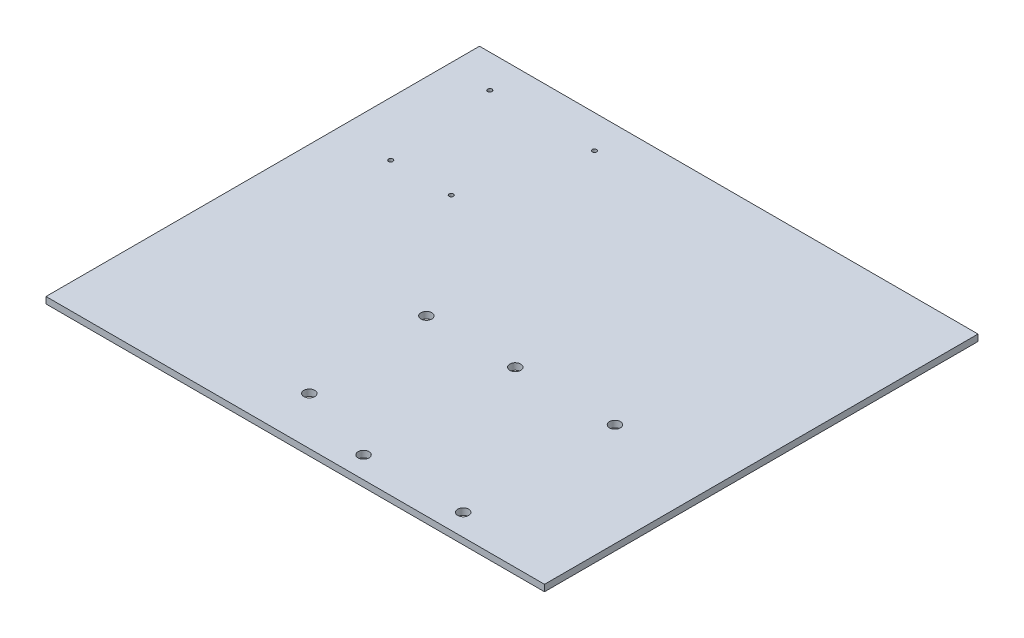
ISO-10303-21;
HEADER;
FILE_DESCRIPTION(('STEP AP214'),'2;1');
FILE_NAME('part.step','',(''),(''),'','','');
FILE_SCHEMA(('AUTOMOTIVE_DESIGN { 1 0 10303 214 1 1 1 1 }'));
ENDSEC;
DATA;
#1=APPLICATION_CONTEXT('core data for automotive mechanical design processes');
#2=APPLICATION_PROTOCOL_DEFINITION('international standard','automotive_design',2000,#1);
#3=PRODUCT_CONTEXT('',#1,'mechanical');
#4=PRODUCT('Part','Part','',(#3));
#5=PRODUCT_RELATED_PRODUCT_CATEGORY('part','',(#4));
#6=PRODUCT_DEFINITION_FORMATION('','',#4);
#7=PRODUCT_DEFINITION_CONTEXT('part definition',#1,'design');
#8=PRODUCT_DEFINITION('design','',#6,#7);
#9=PRODUCT_DEFINITION_SHAPE('','',#8);
#10=(LENGTH_UNIT() NAMED_UNIT(*) SI_UNIT(.MILLI.,.METRE.));
#11=(NAMED_UNIT(*) PLANE_ANGLE_UNIT() SI_UNIT($,.RADIAN.));
#12=(NAMED_UNIT(*) SI_UNIT($,.STERADIAN.) SOLID_ANGLE_UNIT());
#13=UNCERTAINTY_MEASURE_WITH_UNIT(LENGTH_MEASURE(1.E-05),#10,'distance_accuracy_value','');
#14=(GEOMETRIC_REPRESENTATION_CONTEXT(3) GLOBAL_UNCERTAINTY_ASSIGNED_CONTEXT((#13)) GLOBAL_UNIT_ASSIGNED_CONTEXT((#10,
#11,#12)) REPRESENTATION_CONTEXT('',''));
#15=CARTESIAN_POINT('',(0.,0.,0.));
#16=DIRECTION('',(0.,0.,1.));
#17=DIRECTION('',(1.,0.,0.));
#18=AXIS2_PLACEMENT_3D('',#15,#16,#17);
#19=CARTESIAN_POINT('',(0.,3.,0.));
#20=DIRECTION('',(0.,1.,0.));
#21=DIRECTION('',(0.,0.,1.));
#22=AXIS2_PLACEMENT_3D('',#19,#20,#21);
#23=PLANE('',#22);
#24=CARTESIAN_POINT('',(-176.98,3.,-133.96));
#25=DIRECTION('',(0.,1.,0.));
#26=DIRECTION('',(0.,0.,1.));
#27=AXIS2_PLACEMENT_3D('',#24,#25,#26);
#28=CIRCLE('',#27,0.999999999999998);
#29=CARTESIAN_POINT('',(-176.98,3.,-132.96));
#30=VERTEX_POINT('',#29);
#31=EDGE_CURVE('E194',#30,#30,#28,.T.);
#32=ORIENTED_EDGE('',*,*,#31,.F.);
#33=EDGE_LOOP('',(#32));
#34=FACE_BOUND('',#33,.T.);
#35=CARTESIAN_POINT('',(-210.,3.,-184.76));
#36=DIRECTION('',(0.,1.,0.));
#37=DIRECTION('',(0.,0.,1.));
#38=AXIS2_PLACEMENT_3D('',#35,#36,#37);
#39=CIRCLE('',#38,0.999999999999998);
#40=CARTESIAN_POINT('',(-210.,3.,-183.76));
#41=VERTEX_POINT('',#40);
#42=EDGE_CURVE('E178',#41,#41,#39,.T.);
#43=ORIENTED_EDGE('',*,*,#42,.F.);
#44=EDGE_LOOP('',(#43));
#45=FACE_BOUND('',#44,.T.);
#46=CARTESIAN_POINT('',(-47.5,3.,-9.99999999999999));
#47=DIRECTION('',(0.,1.,0.));
#48=DIRECTION('',(0.,0.,1.));
#49=AXIS2_PLACEMENT_3D('',#46,#47,#48);
#50=CIRCLE('',#49,2.525);
#51=CARTESIAN_POINT('',(-47.5,3.,-7.47499999999999));
#52=VERTEX_POINT('',#51);
#53=EDGE_CURVE('E162',#52,#52,#50,.T.);
#54=ORIENTED_EDGE('',*,*,#53,.F.);
#55=EDGE_LOOP('',(#54));
#56=FACE_BOUND('',#55,.T.);
#57=CARTESIAN_POINT('',(-93.5,3.,-80.));
#58=DIRECTION('',(0.,1.,0.));
#59=DIRECTION('',(0.,0.,1.));
#60=AXIS2_PLACEMENT_3D('',#57,#58,#59);
#61=CIRCLE('',#60,2.52499999999999);
#62=CARTESIAN_POINT('',(-93.5,3.,-77.475));
#63=VERTEX_POINT('',#62);
#64=EDGE_CURVE('E146',#63,#63,#61,.T.);
#65=ORIENTED_EDGE('',*,*,#64,.F.);
#66=EDGE_LOOP('',(#65));
#67=FACE_BOUND('',#66,.T.);
#68=CARTESIAN_POINT('',(-130.5,3.,-22.));
#69=DIRECTION('',(0.,1.,0.));
#70=DIRECTION('',(0.,0.,1.));
#71=AXIS2_PLACEMENT_3D('',#68,#69,#70);
#72=CIRCLE('',#71,2.52500000000001);
#73=CARTESIAN_POINT('',(-130.5,3.,-19.475));
#74=VERTEX_POINT('',#73);
#75=EDGE_CURVE('E116',#74,#74,#72,.T.);
#76=ORIENTED_EDGE('',*,*,#75,.F.);
#77=EDGE_LOOP('',(#76));
#78=FACE_BOUND('',#77,.T.);
#79=DIRECTION('',(0.,0.,-1.));
#80=VECTOR('',#79,1.);
#81=CARTESIAN_POINT('',(0.,3.,0.));
#82=LINE('',#81,#80);
#83=CARTESIAN_POINT('',(0.,3.,0.));
#84=VERTEX_POINT('',#83);
#85=CARTESIAN_POINT('',(0.,3.,-200.));
#86=VERTEX_POINT('',#85);
#87=EDGE_CURVE('E96',#84,#86,#82,.T.);
#88=ORIENTED_EDGE('',*,*,#87,.T.);
#89=DIRECTION('',(-1.,0.,0.));
#90=VECTOR('',#89,1.);
#91=CARTESIAN_POINT('',(0.,3.,-200.));
#92=LINE('',#91,#90);
#93=CARTESIAN_POINT('',(-230.,3.,-200.));
#94=VERTEX_POINT('',#93);
#95=EDGE_CURVE('E91',#86,#94,#92,.T.);
#96=ORIENTED_EDGE('',*,*,#95,.T.);
#97=DIRECTION('',(0.,0.,1.));
#98=VECTOR('',#97,1.);
#99=CARTESIAN_POINT('',(-230.,3.,0.));
#100=LINE('',#99,#98);
#101=CARTESIAN_POINT('',(-230.,3.,0.));
#102=VERTEX_POINT('',#101);
#103=EDGE_CURVE('E94',#94,#102,#100,.T.);
#104=ORIENTED_EDGE('',*,*,#103,.T.);
#105=DIRECTION('',(1.,0.,0.));
#106=VECTOR('',#105,1.);
#107=CARTESIAN_POINT('',(0.,3.,0.));
#108=LINE('',#107,#106);
#109=EDGE_CURVE('E61',#102,#84,#108,.T.);
#110=ORIENTED_EDGE('',*,*,#109,.T.);
#111=EDGE_LOOP('',(#88,#96,#104,#110));
#112=FACE_BOUND('',#111,.T.);
#113=CARTESIAN_POINT('',(-134.5,3.,-80.));
#114=DIRECTION('',(0.,1.,0.));
#115=DIRECTION('',(0.,0.,1.));
#116=AXIS2_PLACEMENT_3D('',#113,#114,#115);
#117=CIRCLE('',#116,2.52500000000001);
#118=CARTESIAN_POINT('',(-134.5,3.,-77.475));
#119=VERTEX_POINT('',#118);
#120=EDGE_CURVE('E138',#119,#119,#117,.T.);
#121=ORIENTED_EDGE('',*,*,#120,.F.);
#122=EDGE_LOOP('',(#121));
#123=FACE_BOUND('',#122,.T.);
#124=CARTESIAN_POINT('',(-47.5,3.,-80.));
#125=DIRECTION('',(0.,1.,0.));
#126=DIRECTION('',(0.,0.,1.));
#127=AXIS2_PLACEMENT_3D('',#124,#125,#126);
#128=CIRCLE('',#127,2.525);
#129=CARTESIAN_POINT('',(-47.5,3.,-77.475));
#130=VERTEX_POINT('',#129);
#131=EDGE_CURVE('E154',#130,#130,#128,.T.);
#132=ORIENTED_EDGE('',*,*,#131,.F.);
#133=EDGE_LOOP('',(#132));
#134=FACE_BOUND('',#133,.T.);
#135=CARTESIAN_POINT('',(-93.5,3.,-9.99999999999999));
#136=DIRECTION('',(0.,1.,0.));
#137=DIRECTION('',(0.,0.,1.));
#138=AXIS2_PLACEMENT_3D('',#135,#136,#137);
#139=CIRCLE('',#138,2.52499999999999);
#140=CARTESIAN_POINT('',(-93.5,3.,-7.475));
#141=VERTEX_POINT('',#140);
#142=EDGE_CURVE('E170',#141,#141,#139,.T.);
#143=ORIENTED_EDGE('',*,*,#142,.F.);
#144=EDGE_LOOP('',(#143));
#145=FACE_BOUND('',#144,.T.);
#146=CARTESIAN_POINT('',(-161.74,3.,-184.76));
#147=DIRECTION('',(0.,1.,0.));
#148=DIRECTION('',(0.,0.,1.));
#149=AXIS2_PLACEMENT_3D('',#146,#147,#148);
#150=CIRCLE('',#149,0.999999999999998);
#151=CARTESIAN_POINT('',(-161.74,3.,-183.76));
#152=VERTEX_POINT('',#151);
#153=EDGE_CURVE('E186',#152,#152,#150,.T.);
#154=ORIENTED_EDGE('',*,*,#153,.F.);
#155=EDGE_LOOP('',(#154));
#156=FACE_BOUND('',#155,.T.);
#157=CARTESIAN_POINT('',(-204.92,3.,-133.96));
#158=DIRECTION('',(0.,1.,0.));
#159=DIRECTION('',(0.,0.,1.));
#160=AXIS2_PLACEMENT_3D('',#157,#158,#159);
#161=CIRCLE('',#160,0.999999999999998);
#162=CARTESIAN_POINT('',(-204.92,3.,-132.96));
#163=VERTEX_POINT('',#162);
#164=EDGE_CURVE('E202',#163,#163,#161,.T.);
#165=ORIENTED_EDGE('',*,*,#164,.F.);
#166=EDGE_LOOP('',(#165));
#167=FACE_BOUND('',#166,.T.);
#168=ADVANCED_FACE('F43',(#34,#45,#56,#67,#78,#112,#123,#134,#145,#156,#167),#23,.T.);
#169=CARTESIAN_POINT('',(0.,0.,0.));
#170=DIRECTION('',(0.,1.,0.));
#171=DIRECTION('',(0.,0.,1.));
#172=AXIS2_PLACEMENT_3D('',#169,#170,#171);
#173=PLANE('',#172);
#174=DIRECTION('',(0.,0.,-1.));
#175=VECTOR('',#174,1.);
#176=CARTESIAN_POINT('',(0.,0.,0.));
#177=LINE('',#176,#175);
#178=CARTESIAN_POINT('',(0.,0.,0.));
#179=VERTEX_POINT('',#178);
#180=CARTESIAN_POINT('',(0.,0.,-200.));
#181=VERTEX_POINT('',#180);
#182=EDGE_CURVE('E112',#179,#181,#177,.T.);
#183=ORIENTED_EDGE('',*,*,#182,.F.);
#184=DIRECTION('',(1.,0.,0.));
#185=VECTOR('',#184,1.);
#186=CARTESIAN_POINT('',(0.,0.,0.));
#187=LINE('',#186,#185);
#188=CARTESIAN_POINT('',(-230.,0.,0.));
#189=VERTEX_POINT('',#188);
#190=EDGE_CURVE('E84',#189,#179,#187,.T.);
#191=ORIENTED_EDGE('',*,*,#190,.F.);
#192=DIRECTION('',(0.,0.,1.));
#193=VECTOR('',#192,1.);
#194=CARTESIAN_POINT('',(-230.,0.,0.));
#195=LINE('',#194,#193);
#196=CARTESIAN_POINT('',(-230.,0.,-200.));
#197=VERTEX_POINT('',#196);
#198=EDGE_CURVE('E78',#197,#189,#195,.T.);
#199=ORIENTED_EDGE('',*,*,#198,.F.);
#200=DIRECTION('',(-1.,0.,0.));
#201=VECTOR('',#200,1.);
#202=CARTESIAN_POINT('',(0.,0.,-200.));
#203=LINE('',#202,#201);
#204=EDGE_CURVE('E101',#181,#197,#203,.T.);
#205=ORIENTED_EDGE('',*,*,#204,.F.);
#206=EDGE_LOOP('',(#183,#191,#199,#205));
#207=FACE_BOUND('',#206,.T.);
#208=CARTESIAN_POINT('',(-130.5,0.,-22.));
#209=DIRECTION('',(0.,1.,0.));
#210=DIRECTION('',(0.,0.,1.));
#211=AXIS2_PLACEMENT_3D('',#208,#209,#210);
#212=CIRCLE('',#211,2.52500000000001);
#213=CARTESIAN_POINT('',(-130.5,0.,-19.475));
#214=VERTEX_POINT('',#213);
#215=EDGE_CURVE('E134',#214,#214,#212,.T.);
#216=ORIENTED_EDGE('',*,*,#215,.T.);
#217=EDGE_LOOP('',(#216));
#218=FACE_BOUND('',#217,.T.);
#219=CARTESIAN_POINT('',(-134.5,0.,-80.));
#220=DIRECTION('',(0.,1.,0.));
#221=DIRECTION('',(0.,0.,1.));
#222=AXIS2_PLACEMENT_3D('',#219,#220,#221);
#223=CIRCLE('',#222,2.52500000000001);
#224=CARTESIAN_POINT('',(-134.5,0.,-77.475));
#225=VERTEX_POINT('',#224);
#226=EDGE_CURVE('E142',#225,#225,#223,.T.);
#227=ORIENTED_EDGE('',*,*,#226,.T.);
#228=EDGE_LOOP('',(#227));
#229=FACE_BOUND('',#228,.T.);
#230=CARTESIAN_POINT('',(-93.5,0.,-80.));
#231=DIRECTION('',(0.,1.,0.));
#232=DIRECTION('',(0.,0.,1.));
#233=AXIS2_PLACEMENT_3D('',#230,#231,#232);
#234=CIRCLE('',#233,2.52499999999999);
#235=CARTESIAN_POINT('',(-93.5,0.,-77.475));
#236=VERTEX_POINT('',#235);
#237=EDGE_CURVE('E150',#236,#236,#234,.T.);
#238=ORIENTED_EDGE('',*,*,#237,.T.);
#239=EDGE_LOOP('',(#238));
#240=FACE_BOUND('',#239,.T.);
#241=CARTESIAN_POINT('',(-47.5,0.,-80.));
#242=DIRECTION('',(0.,1.,0.));
#243=DIRECTION('',(0.,0.,1.));
#244=AXIS2_PLACEMENT_3D('',#241,#242,#243);
#245=CIRCLE('',#244,2.525);
#246=CARTESIAN_POINT('',(-47.5,0.,-77.475));
#247=VERTEX_POINT('',#246);
#248=EDGE_CURVE('E158',#247,#247,#245,.T.);
#249=ORIENTED_EDGE('',*,*,#248,.T.);
#250=EDGE_LOOP('',(#249));
#251=FACE_BOUND('',#250,.T.);
#252=CARTESIAN_POINT('',(-47.5,0.,-9.99999999999999));
#253=DIRECTION('',(0.,1.,0.));
#254=DIRECTION('',(0.,0.,1.));
#255=AXIS2_PLACEMENT_3D('',#252,#253,#254);
#256=CIRCLE('',#255,2.525);
#257=CARTESIAN_POINT('',(-47.5,0.,-7.47499999999999));
#258=VERTEX_POINT('',#257);
#259=EDGE_CURVE('E166',#258,#258,#256,.T.);
#260=ORIENTED_EDGE('',*,*,#259,.T.);
#261=EDGE_LOOP('',(#260));
#262=FACE_BOUND('',#261,.T.);
#263=CARTESIAN_POINT('',(-93.5,0.,-9.99999999999999));
#264=DIRECTION('',(0.,1.,0.));
#265=DIRECTION('',(0.,0.,1.));
#266=AXIS2_PLACEMENT_3D('',#263,#264,#265);
#267=CIRCLE('',#266,2.52499999999999);
#268=CARTESIAN_POINT('',(-93.5,0.,-7.475));
#269=VERTEX_POINT('',#268);
#270=EDGE_CURVE('E174',#269,#269,#267,.T.);
#271=ORIENTED_EDGE('',*,*,#270,.T.);
#272=EDGE_LOOP('',(#271));
#273=FACE_BOUND('',#272,.T.);
#274=CARTESIAN_POINT('',(-210.,0.,-184.76));
#275=DIRECTION('',(0.,1.,0.));
#276=DIRECTION('',(0.,0.,1.));
#277=AXIS2_PLACEMENT_3D('',#274,#275,#276);
#278=CIRCLE('',#277,0.999999999999998);
#279=CARTESIAN_POINT('',(-210.,0.,-183.76));
#280=VERTEX_POINT('',#279);
#281=EDGE_CURVE('E182',#280,#280,#278,.T.);
#282=ORIENTED_EDGE('',*,*,#281,.T.);
#283=EDGE_LOOP('',(#282));
#284=FACE_BOUND('',#283,.T.);
#285=CARTESIAN_POINT('',(-161.74,0.,-184.76));
#286=DIRECTION('',(0.,1.,0.));
#287=DIRECTION('',(0.,0.,1.));
#288=AXIS2_PLACEMENT_3D('',#285,#286,#287);
#289=CIRCLE('',#288,0.999999999999998);
#290=CARTESIAN_POINT('',(-161.74,0.,-183.76));
#291=VERTEX_POINT('',#290);
#292=EDGE_CURVE('E190',#291,#291,#289,.T.);
#293=ORIENTED_EDGE('',*,*,#292,.T.);
#294=EDGE_LOOP('',(#293));
#295=FACE_BOUND('',#294,.T.);
#296=CARTESIAN_POINT('',(-176.98,0.,-133.96));
#297=DIRECTION('',(0.,1.,0.));
#298=DIRECTION('',(0.,0.,1.));
#299=AXIS2_PLACEMENT_3D('',#296,#297,#298);
#300=CIRCLE('',#299,0.999999999999998);
#301=CARTESIAN_POINT('',(-176.98,0.,-132.96));
#302=VERTEX_POINT('',#301);
#303=EDGE_CURVE('E198',#302,#302,#300,.T.);
#304=ORIENTED_EDGE('',*,*,#303,.T.);
#305=EDGE_LOOP('',(#304));
#306=FACE_BOUND('',#305,.T.);
#307=CARTESIAN_POINT('',(-204.92,0.,-133.96));
#308=DIRECTION('',(0.,1.,0.));
#309=DIRECTION('',(0.,0.,1.));
#310=AXIS2_PLACEMENT_3D('',#307,#308,#309);
#311=CIRCLE('',#310,0.999999999999998);
#312=CARTESIAN_POINT('',(-204.92,0.,-132.96));
#313=VERTEX_POINT('',#312);
#314=EDGE_CURVE('E206',#313,#313,#311,.T.);
#315=ORIENTED_EDGE('',*,*,#314,.T.);
#316=EDGE_LOOP('',(#315));
#317=FACE_BOUND('',#316,.T.);
#318=ADVANCED_FACE('F129',(#207,#218,#229,#240,#251,#262,#273,#284,#295,#306,#317),#173,.F.);
#319=CARTESIAN_POINT('',(0.,3.,0.));
#320=DIRECTION('',(-1.,0.,0.));
#321=DIRECTION('',(0.,0.,1.));
#322=AXIS2_PLACEMENT_3D('',#319,#320,#321);
#323=PLANE('',#322);
#324=ORIENTED_EDGE('',*,*,#182,.T.);
#325=DIRECTION('',(0.,-1.,0.));
#326=VECTOR('',#325,1.);
#327=CARTESIAN_POINT('',(0.,3.,-200.));
#328=LINE('',#327,#326);
#329=EDGE_CURVE('E11',#86,#181,#328,.T.);
#330=ORIENTED_EDGE('',*,*,#329,.F.);
#331=ORIENTED_EDGE('',*,*,#87,.F.);
#332=DIRECTION('',(0.,-1.,0.));
#333=VECTOR('',#332,1.);
#334=CARTESIAN_POINT('',(0.,3.,0.));
#335=LINE('',#334,#333);
#336=EDGE_CURVE('E108',#84,#179,#335,.T.);
#337=ORIENTED_EDGE('',*,*,#336,.T.);
#338=EDGE_LOOP('',(#324,#330,#331,#337));
#339=FACE_BOUND('',#338,.T.);
#340=ADVANCED_FACE('F45',(#339),#323,.F.);
#341=CARTESIAN_POINT('',(0.,3.,-200.));
#342=DIRECTION('',(0.,0.,1.));
#343=DIRECTION('',(1.,0.,0.));
#344=AXIS2_PLACEMENT_3D('',#341,#342,#343);
#345=PLANE('',#344);
#346=ORIENTED_EDGE('',*,*,#204,.T.);
#347=DIRECTION('',(0.,-1.,0.));
#348=VECTOR('',#347,1.);
#349=CARTESIAN_POINT('',(-230.,3.,-200.));
#350=LINE('',#349,#348);
#351=EDGE_CURVE('E53',#94,#197,#350,.T.);
#352=ORIENTED_EDGE('',*,*,#351,.F.);
#353=ORIENTED_EDGE('',*,*,#95,.F.);
#354=ORIENTED_EDGE('',*,*,#329,.T.);
#355=EDGE_LOOP('',(#346,#352,#353,#354));
#356=FACE_BOUND('',#355,.T.);
#357=ADVANCED_FACE('F100',(#356),#345,.F.);
#358=CARTESIAN_POINT('',(-230.,3.,0.));
#359=DIRECTION('',(1.,0.,0.));
#360=DIRECTION('',(0.,0.,-1.));
#361=AXIS2_PLACEMENT_3D('',#358,#359,#360);
#362=PLANE('',#361);
#363=ORIENTED_EDGE('',*,*,#198,.T.);
#364=DIRECTION('',(0.,-1.,0.));
#365=VECTOR('',#364,1.);
#366=CARTESIAN_POINT('',(-230.,3.,0.));
#367=LINE('',#366,#365);
#368=EDGE_CURVE('E103',#102,#189,#367,.T.);
#369=ORIENTED_EDGE('',*,*,#368,.F.);
#370=ORIENTED_EDGE('',*,*,#103,.F.);
#371=ORIENTED_EDGE('',*,*,#351,.T.);
#372=EDGE_LOOP('',(#363,#369,#370,#371));
#373=FACE_BOUND('',#372,.T.);
#374=ADVANCED_FACE('F104',(#373),#362,.F.);
#375=CARTESIAN_POINT('',(0.,3.,0.));
#376=DIRECTION('',(0.,0.,-1.));
#377=DIRECTION('',(-1.,0.,0.));
#378=AXIS2_PLACEMENT_3D('',#375,#376,#377);
#379=PLANE('',#378);
#380=ORIENTED_EDGE('',*,*,#190,.T.);
#381=ORIENTED_EDGE('',*,*,#336,.F.);
#382=ORIENTED_EDGE('',*,*,#109,.F.);
#383=ORIENTED_EDGE('',*,*,#368,.T.);
#384=EDGE_LOOP('',(#380,#381,#382,#383));
#385=FACE_BOUND('',#384,.T.);
#386=ADVANCED_FACE('F126',(#385),#379,.F.);
#387=CARTESIAN_POINT('',(-130.5,3.,-22.));
#388=DIRECTION('',(0.,-1.,0.));
#389=DIRECTION('',(0.,0.,-1.));
#390=AXIS2_PLACEMENT_3D('',#387,#388,#389);
#391=CYLINDRICAL_SURFACE('',#390,2.52500000000001);
#392=ORIENTED_EDGE('',*,*,#75,.T.);
#393=EDGE_LOOP('',(#392));
#394=FACE_BOUND('',#393,.T.);
#395=ORIENTED_EDGE('',*,*,#215,.F.);
#396=EDGE_LOOP('',(#395));
#397=FACE_BOUND('',#396,.T.);
#398=ADVANCED_FACE('F227',(#394,#397),#391,.F.);
#399=CARTESIAN_POINT('',(-134.5,3.,-80.));
#400=DIRECTION('',(0.,-1.,0.));
#401=DIRECTION('',(0.,0.,-1.));
#402=AXIS2_PLACEMENT_3D('',#399,#400,#401);
#403=CYLINDRICAL_SURFACE('',#402,2.52500000000001);
#404=ORIENTED_EDGE('',*,*,#120,.T.);
#405=EDGE_LOOP('',(#404));
#406=FACE_BOUND('',#405,.T.);
#407=ORIENTED_EDGE('',*,*,#226,.F.);
#408=EDGE_LOOP('',(#407));
#409=FACE_BOUND('',#408,.T.);
#410=ADVANCED_FACE('F281',(#406,#409),#403,.F.);
#411=CARTESIAN_POINT('',(-93.5,3.,-80.));
#412=DIRECTION('',(0.,-1.,0.));
#413=DIRECTION('',(0.,0.,-1.));
#414=AXIS2_PLACEMENT_3D('',#411,#412,#413);
#415=CYLINDRICAL_SURFACE('',#414,2.52499999999999);
#416=ORIENTED_EDGE('',*,*,#64,.T.);
#417=EDGE_LOOP('',(#416));
#418=FACE_BOUND('',#417,.T.);
#419=ORIENTED_EDGE('',*,*,#237,.F.);
#420=EDGE_LOOP('',(#419));
#421=FACE_BOUND('',#420,.T.);
#422=ADVANCED_FACE('F290',(#418,#421),#415,.F.);
#423=CARTESIAN_POINT('',(-47.5,3.,-80.));
#424=DIRECTION('',(0.,-1.,0.));
#425=DIRECTION('',(0.,0.,-1.));
#426=AXIS2_PLACEMENT_3D('',#423,#424,#425);
#427=CYLINDRICAL_SURFACE('',#426,2.525);
#428=ORIENTED_EDGE('',*,*,#131,.T.);
#429=EDGE_LOOP('',(#428));
#430=FACE_BOUND('',#429,.T.);
#431=ORIENTED_EDGE('',*,*,#248,.F.);
#432=EDGE_LOOP('',(#431));
#433=FACE_BOUND('',#432,.T.);
#434=ADVANCED_FACE('F299',(#430,#433),#427,.F.);
#435=CARTESIAN_POINT('',(-47.5,3.,-9.99999999999999));
#436=DIRECTION('',(0.,-1.,0.));
#437=DIRECTION('',(0.,0.,-1.));
#438=AXIS2_PLACEMENT_3D('',#435,#436,#437);
#439=CYLINDRICAL_SURFACE('',#438,2.525);
#440=ORIENTED_EDGE('',*,*,#53,.T.);
#441=EDGE_LOOP('',(#440));
#442=FACE_BOUND('',#441,.T.);
#443=ORIENTED_EDGE('',*,*,#259,.F.);
#444=EDGE_LOOP('',(#443));
#445=FACE_BOUND('',#444,.T.);
#446=ADVANCED_FACE('F309',(#442,#445),#439,.F.);
#447=CARTESIAN_POINT('',(-93.5,3.,-9.99999999999999));
#448=DIRECTION('',(0.,-1.,0.));
#449=DIRECTION('',(0.,0.,-1.));
#450=AXIS2_PLACEMENT_3D('',#447,#448,#449);
#451=CYLINDRICAL_SURFACE('',#450,2.52499999999999);
#452=ORIENTED_EDGE('',*,*,#142,.T.);
#453=EDGE_LOOP('',(#452));
#454=FACE_BOUND('',#453,.T.);
#455=ORIENTED_EDGE('',*,*,#270,.F.);
#456=EDGE_LOOP('',(#455));
#457=FACE_BOUND('',#456,.T.);
#458=ADVANCED_FACE('F319',(#454,#457),#451,.F.);
#459=CARTESIAN_POINT('',(-210.,3.,-184.76));
#460=DIRECTION('',(0.,-1.,0.));
#461=DIRECTION('',(0.,0.,-1.));
#462=AXIS2_PLACEMENT_3D('',#459,#460,#461);
#463=CYLINDRICAL_SURFACE('',#462,0.999999999999998);
#464=ORIENTED_EDGE('',*,*,#42,.T.);
#465=EDGE_LOOP('',(#464));
#466=FACE_BOUND('',#465,.T.);
#467=ORIENTED_EDGE('',*,*,#281,.F.);
#468=EDGE_LOOP('',(#467));
#469=FACE_BOUND('',#468,.T.);
#470=ADVANCED_FACE('F329',(#466,#469),#463,.F.);
#471=CARTESIAN_POINT('',(-161.74,3.,-184.76));
#472=DIRECTION('',(0.,-1.,0.));
#473=DIRECTION('',(0.,0.,-1.));
#474=AXIS2_PLACEMENT_3D('',#471,#472,#473);
#475=CYLINDRICAL_SURFACE('',#474,0.999999999999998);
#476=ORIENTED_EDGE('',*,*,#153,.T.);
#477=EDGE_LOOP('',(#476));
#478=FACE_BOUND('',#477,.T.);
#479=ORIENTED_EDGE('',*,*,#292,.F.);
#480=EDGE_LOOP('',(#479));
#481=FACE_BOUND('',#480,.T.);
#482=ADVANCED_FACE('F339',(#478,#481),#475,.F.);
#483=CARTESIAN_POINT('',(-176.98,3.,-133.96));
#484=DIRECTION('',(0.,-1.,0.));
#485=DIRECTION('',(0.,0.,-1.));
#486=AXIS2_PLACEMENT_3D('',#483,#484,#485);
#487=CYLINDRICAL_SURFACE('',#486,0.999999999999998);
#488=ORIENTED_EDGE('',*,*,#31,.T.);
#489=EDGE_LOOP('',(#488));
#490=FACE_BOUND('',#489,.T.);
#491=ORIENTED_EDGE('',*,*,#303,.F.);
#492=EDGE_LOOP('',(#491));
#493=FACE_BOUND('',#492,.T.);
#494=ADVANCED_FACE('F349',(#490,#493),#487,.F.);
#495=CARTESIAN_POINT('',(-204.92,3.,-133.96));
#496=DIRECTION('',(0.,-1.,0.));
#497=DIRECTION('',(0.,0.,-1.));
#498=AXIS2_PLACEMENT_3D('',#495,#496,#497);
#499=CYLINDRICAL_SURFACE('',#498,0.999999999999998);
#500=ORIENTED_EDGE('',*,*,#164,.T.);
#501=EDGE_LOOP('',(#500));
#502=FACE_BOUND('',#501,.T.);
#503=ORIENTED_EDGE('',*,*,#314,.F.);
#504=EDGE_LOOP('',(#503));
#505=FACE_BOUND('',#504,.T.);
#506=ADVANCED_FACE('F214',(#502,#505),#499,.F.);
#507=CLOSED_SHELL('',(#168,#318,#340,#357,#374,#386,#398,#410,#422,#434,#446,#458,#470,#482,
#494,#506));
#508=MANIFOLD_SOLID_BREP('B2',#507);
#509=ADVANCED_BREP_SHAPE_REPRESENTATION('',(#18,#508),#14);
#510=SHAPE_DEFINITION_REPRESENTATION(#9,#509);
ENDSEC;
END-ISO-10303-21;
